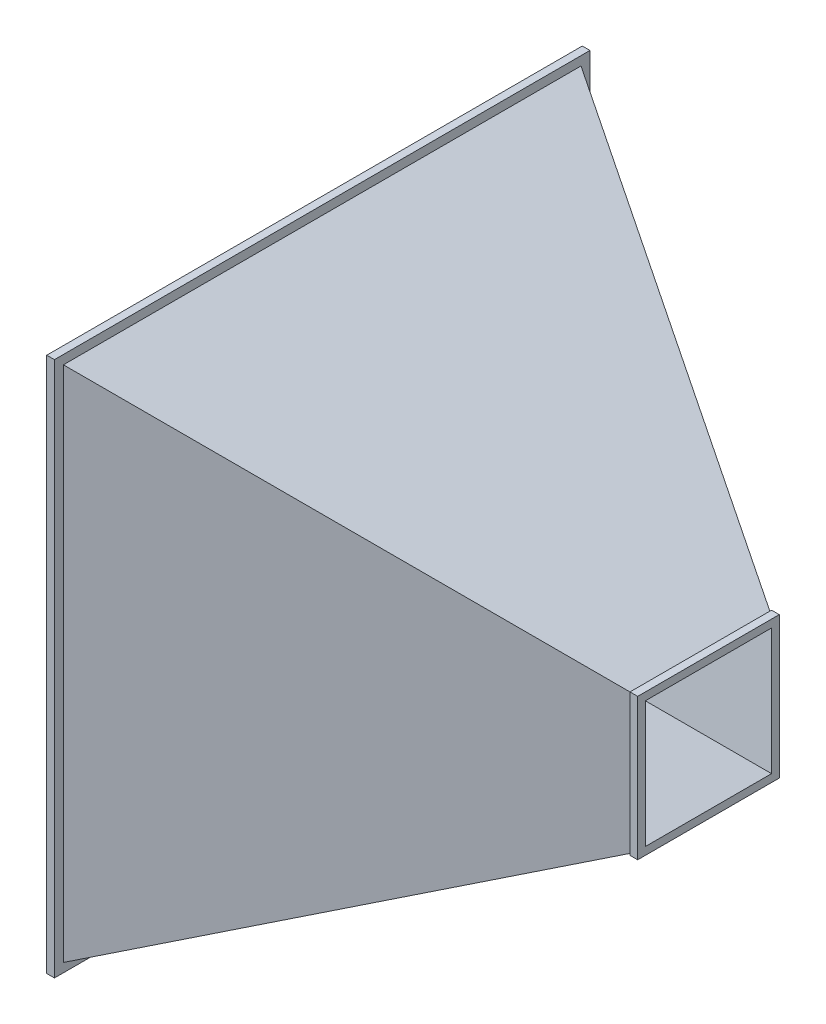
ISO-10303-21;
HEADER;
FILE_DESCRIPTION(('STEP AP214'),'2;1');
FILE_NAME('part.step','',(''),(''),'','','');
FILE_SCHEMA(('AUTOMOTIVE_DESIGN { 1 0 10303 214 1 1 1 1 }'));
ENDSEC;
DATA;
#1=APPLICATION_CONTEXT('core data for automotive mechanical design processes');
#2=APPLICATION_PROTOCOL_DEFINITION('international standard','automotive_design',2000,#1);
#3=PRODUCT_CONTEXT('',#1,'mechanical');
#4=PRODUCT('Part','Part','',(#3));
#5=PRODUCT_RELATED_PRODUCT_CATEGORY('part','',(#4));
#6=PRODUCT_DEFINITION_FORMATION('','',#4);
#7=PRODUCT_DEFINITION_CONTEXT('part definition',#1,'design');
#8=PRODUCT_DEFINITION('design','',#6,#7);
#9=PRODUCT_DEFINITION_SHAPE('','',#8);
#10=(LENGTH_UNIT() NAMED_UNIT(*) SI_UNIT(.MILLI.,.METRE.));
#11=(NAMED_UNIT(*) PLANE_ANGLE_UNIT() SI_UNIT($,.RADIAN.));
#12=(NAMED_UNIT(*) SI_UNIT($,.STERADIAN.) SOLID_ANGLE_UNIT());
#13=UNCERTAINTY_MEASURE_WITH_UNIT(LENGTH_MEASURE(1.E-05),#10,'distance_accuracy_value','');
#14=(GEOMETRIC_REPRESENTATION_CONTEXT(3) GLOBAL_UNCERTAINTY_ASSIGNED_CONTEXT((#13)) GLOBAL_UNIT_ASSIGNED_CONTEXT((#10,
#11,#12)) REPRESENTATION_CONTEXT('',''));
#15=CARTESIAN_POINT('',(0.,0.,0.));
#16=DIRECTION('',(0.,0.,1.));
#17=DIRECTION('',(1.,0.,0.));
#18=AXIS2_PLACEMENT_3D('',#15,#16,#17);
#19=CARTESIAN_POINT('',(768.,0.,0.));
#20=DIRECTION('',(1.,0.,0.));
#21=DIRECTION('',(0.,0.,-1.));
#22=AXIS2_PLACEMENT_3D('',#19,#20,#21);
#23=PLANE('',#22);
#24=DIRECTION('',(0.,0.,-1.));
#25=VECTOR('',#24,1.);
#26=CARTESIAN_POINT('',(768.,-138.,138.));
#27=LINE('',#26,#25);
#28=CARTESIAN_POINT('',(768.,-138.,138.));
#29=VERTEX_POINT('',#28);
#30=CARTESIAN_POINT('',(768.,-138.,-138.));
#31=VERTEX_POINT('',#30);
#32=EDGE_CURVE('E316',#29,#31,#27,.T.);
#33=ORIENTED_EDGE('',*,*,#32,.T.);
#34=DIRECTION('',(0.,1.,0.));
#35=VECTOR('',#34,1.);
#36=CARTESIAN_POINT('',(768.,-138.,-138.));
#37=LINE('',#36,#35);
#38=CARTESIAN_POINT('',(768.,138.,-138.));
#39=VERTEX_POINT('',#38);
#40=EDGE_CURVE('E341',#31,#39,#37,.T.);
#41=ORIENTED_EDGE('',*,*,#40,.T.);
#42=DIRECTION('',(0.,0.,1.));
#43=VECTOR('',#42,1.);
#44=CARTESIAN_POINT('',(768.,138.,-138.));
#45=LINE('',#44,#43);
#46=CARTESIAN_POINT('',(768.,138.,138.));
#47=VERTEX_POINT('',#46);
#48=EDGE_CURVE('E345',#39,#47,#45,.T.);
#49=ORIENTED_EDGE('',*,*,#48,.T.);
#50=DIRECTION('',(0.,-1.,0.));
#51=VECTOR('',#50,1.);
#52=CARTESIAN_POINT('',(768.,138.,138.));
#53=LINE('',#52,#51);
#54=EDGE_CURVE('E325',#47,#29,#53,.T.);
#55=ORIENTED_EDGE('',*,*,#54,.T.);
#56=EDGE_LOOP('',(#33,#41,#49,#55));
#57=FACE_BOUND('',#56,.T.);
#58=DIRECTION('',(0.,1.,0.));
#59=VECTOR('',#58,1.);
#60=CARTESIAN_POINT('',(768.,123.,-123.));
#61=LINE('',#60,#59);
#62=CARTESIAN_POINT('',(768.,-123.,-123.));
#63=VERTEX_POINT('',#62);
#64=CARTESIAN_POINT('',(768.,123.,-123.));
#65=VERTEX_POINT('',#64);
#66=EDGE_CURVE('E67',#63,#65,#61,.T.);
#67=ORIENTED_EDGE('',*,*,#66,.F.);
#68=DIRECTION('',(0.,0.,-1.));
#69=VECTOR('',#68,1.);
#70=CARTESIAN_POINT('',(768.,-123.,123.));
#71=LINE('',#70,#69);
#72=CARTESIAN_POINT('',(768.,-123.,123.));
#73=VERTEX_POINT('',#72);
#74=EDGE_CURVE('E204',#73,#63,#71,.T.);
#75=ORIENTED_EDGE('',*,*,#74,.F.);
#76=DIRECTION('',(0.,-1.,0.));
#77=VECTOR('',#76,1.);
#78=CARTESIAN_POINT('',(768.,123.,123.));
#79=LINE('',#78,#77);
#80=CARTESIAN_POINT('',(768.,123.,123.));
#81=VERTEX_POINT('',#80);
#82=EDGE_CURVE('E401',#81,#73,#79,.T.);
#83=ORIENTED_EDGE('',*,*,#82,.F.);
#84=DIRECTION('',(0.,0.,1.));
#85=VECTOR('',#84,1.);
#86=CARTESIAN_POINT('',(768.,123.,123.));
#87=LINE('',#86,#85);
#88=EDGE_CURVE('E386',#65,#81,#87,.T.);
#89=ORIENTED_EDGE('',*,*,#88,.F.);
#90=EDGE_LOOP('',(#67,#75,#83,#89));
#91=FACE_BOUND('',#90,.T.);
#92=ADVANCED_FACE('F63',(#57,#91),#23,.T.);
#93=CARTESIAN_POINT('',(0.,0.,0.));
#94=DIRECTION('',(-1.,0.,0.));
#95=DIRECTION('',(0.,0.,1.));
#96=AXIS2_PLACEMENT_3D('',#93,#94,#95);
#97=PLANE('',#96);
#98=DIRECTION('',(0.,0.,-1.));
#99=VECTOR('',#98,1.);
#100=CARTESIAN_POINT('',(0.,522.,522.));
#101=LINE('',#100,#99);
#102=CARTESIAN_POINT('',(0.,522.,522.));
#103=VERTEX_POINT('',#102);
#104=CARTESIAN_POINT('',(0.,522.,-522.));
#105=VERTEX_POINT('',#104);
#106=EDGE_CURVE('E436',#103,#105,#101,.T.);
#107=ORIENTED_EDGE('',*,*,#106,.T.);
#108=DIRECTION('',(0.,-1.,0.));
#109=VECTOR('',#108,1.);
#110=CARTESIAN_POINT('',(0.,522.,-522.));
#111=LINE('',#110,#109);
#112=CARTESIAN_POINT('',(0.,-522.,-522.));
#113=VERTEX_POINT('',#112);
#114=EDGE_CURVE('E720',#105,#113,#111,.T.);
#115=ORIENTED_EDGE('',*,*,#114,.T.);
#116=DIRECTION('',(0.,0.,1.));
#117=VECTOR('',#116,1.);
#118=CARTESIAN_POINT('',(0.,-522.,-522.));
#119=LINE('',#118,#117);
#120=CARTESIAN_POINT('',(0.,-522.,522.));
#121=VERTEX_POINT('',#120);
#122=EDGE_CURVE('E724',#113,#121,#119,.T.);
#123=ORIENTED_EDGE('',*,*,#122,.T.);
#124=DIRECTION('',(0.,1.,0.));
#125=VECTOR('',#124,1.);
#126=CARTESIAN_POINT('',(0.,-522.,522.));
#127=LINE('',#126,#125);
#128=EDGE_CURVE('E703',#121,#103,#127,.T.);
#129=ORIENTED_EDGE('',*,*,#128,.T.);
#130=EDGE_LOOP('',(#107,#115,#123,#129));
#131=FACE_BOUND('',#130,.T.);
#132=DIRECTION('',(0.,1.,0.));
#133=VECTOR('',#132,1.);
#134=CARTESIAN_POINT('',(0.,512.,512.));
#135=LINE('',#134,#133);
#136=CARTESIAN_POINT('',(0.,-512.,512.));
#137=VERTEX_POINT('',#136);
#138=CARTESIAN_POINT('',(0.,512.,512.));
#139=VERTEX_POINT('',#138);
#140=EDGE_CURVE('E90',#137,#139,#135,.T.);
#141=ORIENTED_EDGE('',*,*,#140,.F.);
#142=DIRECTION('',(0.,0.,1.));
#143=VECTOR('',#142,1.);
#144=CARTESIAN_POINT('',(0.,-512.,-512.));
#145=LINE('',#144,#143);
#146=CARTESIAN_POINT('',(0.,-512.,-512.));
#147=VERTEX_POINT('',#146);
#148=EDGE_CURVE('E195',#147,#137,#145,.T.);
#149=ORIENTED_EDGE('',*,*,#148,.F.);
#150=DIRECTION('',(0.,-1.,0.));
#151=VECTOR('',#150,1.);
#152=CARTESIAN_POINT('',(0.,512.,-512.));
#153=LINE('',#152,#151);
#154=CARTESIAN_POINT('',(0.,512.,-512.));
#155=VERTEX_POINT('',#154);
#156=EDGE_CURVE('E183',#155,#147,#153,.T.);
#157=ORIENTED_EDGE('',*,*,#156,.F.);
#158=DIRECTION('',(0.,0.,-1.));
#159=VECTOR('',#158,1.);
#160=CARTESIAN_POINT('',(0.,512.,-512.));
#161=LINE('',#160,#159);
#162=EDGE_CURVE('E194',#139,#155,#161,.T.);
#163=ORIENTED_EDGE('',*,*,#162,.F.);
#164=EDGE_LOOP('',(#141,#149,#157,#163));
#165=FACE_BOUND('',#164,.T.);
#166=ADVANCED_FACE('F210',(#131,#165),#97,.T.);
#167=CARTESIAN_POINT('',(204.8,-409.6,0.));
#168=DIRECTION('',(-0.447213595499958,0.894427190999916,0.));
#169=DIRECTION('',(-0.894427190999916,-0.447213595499958,0.));
#170=AXIS2_PLACEMENT_3D('',#167,#168,#169);
#171=PLANE('',#170);
#172=DIRECTION('',(0.,0.,1.));
#173=VECTOR('',#172,1.);
#174=CARTESIAN_POINT('',(15.,-504.5,0.));
#175=LINE('',#174,#173);
#176=CARTESIAN_POINT('',(14.9999999999999,-504.5,-504.5));
#177=VERTEX_POINT('',#176);
#178=CARTESIAN_POINT('',(15.,-504.5,504.5));
#179=VERTEX_POINT('',#178);
#180=EDGE_CURVE('E310',#177,#179,#175,.T.);
#181=ORIENTED_EDGE('',*,*,#180,.F.);
#182=DIRECTION('',(0.816496580927726,0.408248290463863,0.408248290463863));
#183=VECTOR('',#182,1.);
#184=CARTESIAN_POINT('',(0.,-512.,-512.));
#185=LINE('',#184,#183);
#186=CARTESIAN_POINT('',(753.,-135.5,-135.5));
#187=VERTEX_POINT('',#186);
#188=EDGE_CURVE('E264',#177,#187,#185,.T.);
#189=ORIENTED_EDGE('',*,*,#188,.T.);
#190=DIRECTION('',(0.,0.,-1.));
#191=VECTOR('',#190,1.);
#192=CARTESIAN_POINT('',(753.,-135.5,0.));
#193=LINE('',#192,#191);
#194=CARTESIAN_POINT('',(753.,-135.5,135.5));
#195=VERTEX_POINT('',#194);
#196=EDGE_CURVE('E268',#195,#187,#193,.T.);
#197=ORIENTED_EDGE('',*,*,#196,.F.);
#198=DIRECTION('',(0.816496580927726,0.408248290463863,-0.408248290463863));
#199=VECTOR('',#198,1.);
#200=CARTESIAN_POINT('',(0.,-512.,512.));
#201=LINE('',#200,#199);
#202=EDGE_CURVE('E259',#179,#195,#201,.T.);
#203=ORIENTED_EDGE('',*,*,#202,.F.);
#204=EDGE_LOOP('',(#181,#189,#197,#203));
#205=FACE_BOUND('',#204,.T.);
#206=ADVANCED_FACE('F233',(#205),#171,.F.);
#207=CARTESIAN_POINT('',(204.8,0.,409.6));
#208=DIRECTION('',(-0.447213595499958,0.,-0.894427190999916));
#209=DIRECTION('',(-0.894427190999916,0.,0.447213595499958));
#210=AXIS2_PLACEMENT_3D('',#207,#208,#209);
#211=PLANE('',#210);
#212=DIRECTION('',(0.,1.,0.));
#213=VECTOR('',#212,1.);
#214=CARTESIAN_POINT('',(15.,-1.09395999203787E-13,504.5));
#215=LINE('',#214,#213);
#216=CARTESIAN_POINT('',(15.,504.5,504.5));
#217=VERTEX_POINT('',#216);
#218=EDGE_CURVE('E305',#179,#217,#215,.T.);
#219=ORIENTED_EDGE('',*,*,#218,.F.);
#220=ORIENTED_EDGE('',*,*,#202,.T.);
#221=DIRECTION('',(0.,-1.,0.));
#222=VECTOR('',#221,1.);
#223=CARTESIAN_POINT('',(753.,0.,135.5));
#224=LINE('',#223,#222);
#225=CARTESIAN_POINT('',(753.,135.5,135.5));
#226=VERTEX_POINT('',#225);
#227=EDGE_CURVE('E292',#226,#195,#224,.T.);
#228=ORIENTED_EDGE('',*,*,#227,.F.);
#229=DIRECTION('',(0.816496580927726,-0.408248290463863,-0.408248290463863));
#230=VECTOR('',#229,1.);
#231=CARTESIAN_POINT('',(0.,512.,512.));
#232=LINE('',#231,#230);
#233=EDGE_CURVE('E279',#217,#226,#232,.T.);
#234=ORIENTED_EDGE('',*,*,#233,.F.);
#235=EDGE_LOOP('',(#219,#220,#228,#234));
#236=FACE_BOUND('',#235,.T.);
#237=ADVANCED_FACE('F369',(#236),#211,.F.);
#238=CARTESIAN_POINT('',(204.8,0.,-409.6));
#239=DIRECTION('',(-0.447213595499958,0.,0.894427190999916));
#240=DIRECTION('',(0.894427190999916,0.,0.447213595499958));
#241=AXIS2_PLACEMENT_3D('',#238,#239,#240);
#242=PLANE('',#241);
#243=DIRECTION('',(0.,-1.,0.));
#244=VECTOR('',#243,1.);
#245=CARTESIAN_POINT('',(15.,1.09395999203787E-13,-504.5));
#246=LINE('',#245,#244);
#247=CARTESIAN_POINT('',(15.,504.5,-504.5));
#248=VERTEX_POINT('',#247);
#249=EDGE_CURVE('E300',#248,#177,#246,.T.);
#250=ORIENTED_EDGE('',*,*,#249,.F.);
#251=DIRECTION('',(0.816496580927726,-0.408248290463863,0.408248290463863));
#252=VECTOR('',#251,1.);
#253=CARTESIAN_POINT('',(0.,512.,-512.));
#254=LINE('',#253,#252);
#255=CARTESIAN_POINT('',(753.,135.5,-135.5));
#256=VERTEX_POINT('',#255);
#257=EDGE_CURVE('E263',#248,#256,#254,.T.);
#258=ORIENTED_EDGE('',*,*,#257,.T.);
#259=DIRECTION('',(0.,1.,0.));
#260=VECTOR('',#259,1.);
#261=CARTESIAN_POINT('',(753.,0.,-135.5));
#262=LINE('',#261,#260);
#263=EDGE_CURVE('E294',#187,#256,#262,.T.);
#264=ORIENTED_EDGE('',*,*,#263,.F.);
#265=ORIENTED_EDGE('',*,*,#188,.F.);
#266=EDGE_LOOP('',(#250,#258,#264,#265));
#267=FACE_BOUND('',#266,.T.);
#268=ADVANCED_FACE('F301',(#267),#242,.F.);
#269=CARTESIAN_POINT('',(204.8,409.6,0.));
#270=DIRECTION('',(-0.447213595499958,-0.894427190999916,0.));
#271=DIRECTION('',(0.894427190999916,-0.447213595499958,0.));
#272=AXIS2_PLACEMENT_3D('',#269,#270,#271);
#273=PLANE('',#272);
#274=DIRECTION('',(0.,0.,-1.));
#275=VECTOR('',#274,1.);
#276=CARTESIAN_POINT('',(15.,504.5,0.));
#277=LINE('',#276,#275);
#278=EDGE_CURVE('E12',#217,#248,#277,.T.);
#279=ORIENTED_EDGE('',*,*,#278,.F.);
#280=ORIENTED_EDGE('',*,*,#233,.T.);
#281=DIRECTION('',(0.,0.,1.));
#282=VECTOR('',#281,1.);
#283=CARTESIAN_POINT('',(753.,135.5,0.));
#284=LINE('',#283,#282);
#285=EDGE_CURVE('E74',#256,#226,#284,.T.);
#286=ORIENTED_EDGE('',*,*,#285,.F.);
#287=ORIENTED_EDGE('',*,*,#257,.F.);
#288=EDGE_LOOP('',(#279,#280,#286,#287));
#289=FACE_BOUND('',#288,.T.);
#290=ADVANCED_FACE('F295',(#289),#273,.F.);
#291=CARTESIAN_POINT('',(753.,0.,0.));
#292=DIRECTION('',(1.,0.,0.));
#293=DIRECTION('',(0.,0.,-1.));
#294=AXIS2_PLACEMENT_3D('',#291,#292,#293);
#295=PLANE('',#294);
#296=DIRECTION('',(0.,0.,-1.));
#297=VECTOR('',#296,1.);
#298=CARTESIAN_POINT('',(753.,-138.,138.));
#299=LINE('',#298,#297);
#300=CARTESIAN_POINT('',(753.,-138.,138.));
#301=VERTEX_POINT('',#300);
#302=CARTESIAN_POINT('',(753.,-138.,-138.));
#303=VERTEX_POINT('',#302);
#304=EDGE_CURVE('E320',#301,#303,#299,.T.);
#305=ORIENTED_EDGE('',*,*,#304,.F.);
#306=DIRECTION('',(0.,-1.,0.));
#307=VECTOR('',#306,1.);
#308=CARTESIAN_POINT('',(753.,138.,138.));
#309=LINE('',#308,#307);
#310=CARTESIAN_POINT('',(753.,138.,138.));
#311=VERTEX_POINT('',#310);
#312=EDGE_CURVE('E333',#311,#301,#309,.T.);
#313=ORIENTED_EDGE('',*,*,#312,.F.);
#314=DIRECTION('',(0.,0.,1.));
#315=VECTOR('',#314,1.);
#316=CARTESIAN_POINT('',(753.,138.,-138.));
#317=LINE('',#316,#315);
#318=CARTESIAN_POINT('',(753.,138.,-138.));
#319=VERTEX_POINT('',#318);
#320=EDGE_CURVE('E329',#319,#311,#317,.T.);
#321=ORIENTED_EDGE('',*,*,#320,.F.);
#322=DIRECTION('',(0.,1.,0.));
#323=VECTOR('',#322,1.);
#324=CARTESIAN_POINT('',(753.,-138.,-138.));
#325=LINE('',#324,#323);
#326=EDGE_CURVE('E324',#303,#319,#325,.T.);
#327=ORIENTED_EDGE('',*,*,#326,.F.);
#328=EDGE_LOOP('',(#305,#313,#321,#327));
#329=FACE_BOUND('',#328,.T.);
#330=ORIENTED_EDGE('',*,*,#227,.T.);
#331=ORIENTED_EDGE('',*,*,#196,.T.);
#332=ORIENTED_EDGE('',*,*,#263,.T.);
#333=ORIENTED_EDGE('',*,*,#285,.T.);
#334=EDGE_LOOP('',(#330,#331,#332,#333));
#335=FACE_BOUND('',#334,.T.);
#336=ADVANCED_FACE('F290',(#329,#335),#295,.F.);
#337=CARTESIAN_POINT('',(753.,-138.,138.));
#338=DIRECTION('',(0.,-1.,0.));
#339=DIRECTION('',(0.,0.,-1.));
#340=AXIS2_PLACEMENT_3D('',#337,#338,#339);
#341=PLANE('',#340);
#342=ORIENTED_EDGE('',*,*,#32,.F.);
#343=DIRECTION('',(1.,0.,0.));
#344=VECTOR('',#343,1.);
#345=CARTESIAN_POINT('',(753.,-138.,138.));
#346=LINE('',#345,#344);
#347=EDGE_CURVE('E352',#301,#29,#346,.T.);
#348=ORIENTED_EDGE('',*,*,#347,.F.);
#349=ORIENTED_EDGE('',*,*,#304,.T.);
#350=DIRECTION('',(1.,0.,0.));
#351=VECTOR('',#350,1.);
#352=CARTESIAN_POINT('',(753.,-138.,-138.));
#353=LINE('',#352,#351);
#354=EDGE_CURVE('E337',#303,#31,#353,.T.);
#355=ORIENTED_EDGE('',*,*,#354,.T.);
#356=EDGE_LOOP('',(#342,#348,#349,#355));
#357=FACE_BOUND('',#356,.T.);
#358=ADVANCED_FACE('F235',(#357),#341,.T.);
#359=CARTESIAN_POINT('',(753.,138.,138.));
#360=DIRECTION('',(0.,0.,1.));
#361=DIRECTION('',(0.,-1.,0.));
#362=AXIS2_PLACEMENT_3D('',#359,#360,#361);
#363=PLANE('',#362);
#364=ORIENTED_EDGE('',*,*,#54,.F.);
#365=DIRECTION('',(1.,0.,0.));
#366=VECTOR('',#365,1.);
#367=CARTESIAN_POINT('',(753.,138.,138.));
#368=LINE('',#367,#366);
#369=EDGE_CURVE('E355',#311,#47,#368,.T.);
#370=ORIENTED_EDGE('',*,*,#369,.F.);
#371=ORIENTED_EDGE('',*,*,#312,.T.);
#372=ORIENTED_EDGE('',*,*,#347,.T.);
#373=EDGE_LOOP('',(#364,#370,#371,#372));
#374=FACE_BOUND('',#373,.T.);
#375=ADVANCED_FACE('F646',(#374),#363,.T.);
#376=CARTESIAN_POINT('',(753.,138.,-138.));
#377=DIRECTION('',(0.,1.,0.));
#378=DIRECTION('',(0.,0.,1.));
#379=AXIS2_PLACEMENT_3D('',#376,#377,#378);
#380=PLANE('',#379);
#381=ORIENTED_EDGE('',*,*,#48,.F.);
#382=DIRECTION('',(1.,0.,0.));
#383=VECTOR('',#382,1.);
#384=CARTESIAN_POINT('',(753.,138.,-138.));
#385=LINE('',#384,#383);
#386=EDGE_CURVE('E358',#319,#39,#385,.T.);
#387=ORIENTED_EDGE('',*,*,#386,.F.);
#388=ORIENTED_EDGE('',*,*,#320,.T.);
#389=ORIENTED_EDGE('',*,*,#369,.T.);
#390=EDGE_LOOP('',(#381,#387,#388,#389));
#391=FACE_BOUND('',#390,.T.);
#392=ADVANCED_FACE('F638',(#391),#380,.T.);
#393=CARTESIAN_POINT('',(753.,-138.,-138.));
#394=DIRECTION('',(0.,0.,-1.));
#395=DIRECTION('',(0.,1.,0.));
#396=AXIS2_PLACEMENT_3D('',#393,#394,#395);
#397=PLANE('',#396);
#398=ORIENTED_EDGE('',*,*,#40,.F.);
#399=ORIENTED_EDGE('',*,*,#354,.F.);
#400=ORIENTED_EDGE('',*,*,#326,.T.);
#401=ORIENTED_EDGE('',*,*,#386,.T.);
#402=EDGE_LOOP('',(#398,#399,#400,#401));
#403=FACE_BOUND('',#402,.T.);
#404=ADVANCED_FACE('F610',(#403),#397,.T.);
#405=CARTESIAN_POINT('',(15.,0.,0.));
#406=DIRECTION('',(-1.,0.,0.));
#407=DIRECTION('',(0.,0.,1.));
#408=AXIS2_PLACEMENT_3D('',#405,#406,#407);
#409=PLANE('',#408);
#410=DIRECTION('',(0.,0.,-1.));
#411=VECTOR('',#410,1.);
#412=CARTESIAN_POINT('',(15.,522.,522.));
#413=LINE('',#412,#411);
#414=CARTESIAN_POINT('',(15.,522.,522.));
#415=VERTEX_POINT('',#414);
#416=CARTESIAN_POINT('',(15.,522.,-522.));
#417=VERTEX_POINT('',#416);
#418=EDGE_CURVE('E445',#415,#417,#413,.T.);
#419=ORIENTED_EDGE('',*,*,#418,.F.);
#420=DIRECTION('',(0.,1.,0.));
#421=VECTOR('',#420,1.);
#422=CARTESIAN_POINT('',(15.,-522.,522.));
#423=LINE('',#422,#421);
#424=CARTESIAN_POINT('',(15.,-522.,522.));
#425=VERTEX_POINT('',#424);
#426=EDGE_CURVE('E699',#425,#415,#423,.T.);
#427=ORIENTED_EDGE('',*,*,#426,.F.);
#428=DIRECTION('',(0.,0.,1.));
#429=VECTOR('',#428,1.);
#430=CARTESIAN_POINT('',(15.,-522.,-522.));
#431=LINE('',#430,#429);
#432=CARTESIAN_POINT('',(15.,-522.,-522.));
#433=VERTEX_POINT('',#432);
#434=EDGE_CURVE('E710',#433,#425,#431,.T.);
#435=ORIENTED_EDGE('',*,*,#434,.F.);
#436=DIRECTION('',(0.,-1.,0.));
#437=VECTOR('',#436,1.);
#438=CARTESIAN_POINT('',(15.,522.,-522.));
#439=LINE('',#438,#437);
#440=EDGE_CURVE('E701',#417,#433,#439,.T.);
#441=ORIENTED_EDGE('',*,*,#440,.F.);
#442=EDGE_LOOP('',(#419,#427,#435,#441));
#443=FACE_BOUND('',#442,.T.);
#444=ORIENTED_EDGE('',*,*,#249,.T.);
#445=ORIENTED_EDGE('',*,*,#180,.T.);
#446=ORIENTED_EDGE('',*,*,#218,.T.);
#447=ORIENTED_EDGE('',*,*,#278,.T.);
#448=EDGE_LOOP('',(#444,#445,#446,#447));
#449=FACE_BOUND('',#448,.T.);
#450=ADVANCED_FACE('F309',(#443,#449),#409,.F.);
#451=CARTESIAN_POINT('',(15.,522.,522.));
#452=DIRECTION('',(0.,1.,0.));
#453=DIRECTION('',(0.,0.,1.));
#454=AXIS2_PLACEMENT_3D('',#451,#452,#453);
#455=PLANE('',#454);
#456=ORIENTED_EDGE('',*,*,#106,.F.);
#457=DIRECTION('',(-1.,0.,0.));
#458=VECTOR('',#457,1.);
#459=CARTESIAN_POINT('',(15.,522.,522.));
#460=LINE('',#459,#458);
#461=EDGE_CURVE('E306',#415,#103,#460,.T.);
#462=ORIENTED_EDGE('',*,*,#461,.F.);
#463=ORIENTED_EDGE('',*,*,#418,.T.);
#464=DIRECTION('',(-1.,0.,0.));
#465=VECTOR('',#464,1.);
#466=CARTESIAN_POINT('',(15.,522.,-522.));
#467=LINE('',#466,#465);
#468=EDGE_CURVE('E709',#417,#105,#467,.T.);
#469=ORIENTED_EDGE('',*,*,#468,.T.);
#470=EDGE_LOOP('',(#456,#462,#463,#469));
#471=FACE_BOUND('',#470,.T.);
#472=ADVANCED_FACE('F593',(#471),#455,.T.);
#473=CARTESIAN_POINT('',(15.,-522.,522.));
#474=DIRECTION('',(0.,0.,1.));
#475=DIRECTION('',(1.,0.,0.));
#476=AXIS2_PLACEMENT_3D('',#473,#474,#475);
#477=PLANE('',#476);
#478=ORIENTED_EDGE('',*,*,#128,.F.);
#479=DIRECTION('',(-1.,0.,0.));
#480=VECTOR('',#479,1.);
#481=CARTESIAN_POINT('',(15.,-522.,522.));
#482=LINE('',#481,#480);
#483=EDGE_CURVE('E706',#425,#121,#482,.T.);
#484=ORIENTED_EDGE('',*,*,#483,.F.);
#485=ORIENTED_EDGE('',*,*,#426,.T.);
#486=ORIENTED_EDGE('',*,*,#461,.T.);
#487=EDGE_LOOP('',(#478,#484,#485,#486));
#488=FACE_BOUND('',#487,.T.);
#489=ADVANCED_FACE('F584',(#488),#477,.T.);
#490=CARTESIAN_POINT('',(15.,-522.,-522.));
#491=DIRECTION('',(0.,-1.,0.));
#492=DIRECTION('',(0.,0.,-1.));
#493=AXIS2_PLACEMENT_3D('',#490,#491,#492);
#494=PLANE('',#493);
#495=ORIENTED_EDGE('',*,*,#122,.F.);
#496=DIRECTION('',(-1.,0.,0.));
#497=VECTOR('',#496,1.);
#498=CARTESIAN_POINT('',(15.,-522.,-522.));
#499=LINE('',#498,#497);
#500=EDGE_CURVE('E714',#433,#113,#499,.T.);
#501=ORIENTED_EDGE('',*,*,#500,.F.);
#502=ORIENTED_EDGE('',*,*,#434,.T.);
#503=ORIENTED_EDGE('',*,*,#483,.T.);
#504=EDGE_LOOP('',(#495,#501,#502,#503));
#505=FACE_BOUND('',#504,.T.);
#506=ADVANCED_FACE('F575',(#505),#494,.T.);
#507=CARTESIAN_POINT('',(15.,522.,-522.));
#508=DIRECTION('',(0.,0.,-1.));
#509=DIRECTION('',(-1.,0.,0.));
#510=AXIS2_PLACEMENT_3D('',#507,#508,#509);
#511=PLANE('',#510);
#512=ORIENTED_EDGE('',*,*,#114,.F.);
#513=ORIENTED_EDGE('',*,*,#468,.F.);
#514=ORIENTED_EDGE('',*,*,#440,.T.);
#515=ORIENTED_EDGE('',*,*,#500,.T.);
#516=EDGE_LOOP('',(#512,#513,#514,#515));
#517=FACE_BOUND('',#516,.T.);
#518=ADVANCED_FACE('F474',(#517),#511,.T.);
#519=CARTESIAN_POINT('',(206.384747923821,-407.463975335461,0.));
#520=DIRECTION('',(-0.451853873694725,0.892091966574675,0.));
#521=DIRECTION('',(-0.892091966574675,-0.451853873694725,0.));
#522=AXIS2_PLACEMENT_3D('',#519,#520,#521);
#523=PLANE('',#522);
#524=DIRECTION('',(0.812952891466801,0.411769107787221,0.411769107787221));
#525=VECTOR('',#524,1.);
#526=CARTESIAN_POINT('',(0.,-512.,-512.));
#527=LINE('',#526,#525);
#528=EDGE_CURVE('E187',#147,#63,#527,.T.);
#529=ORIENTED_EDGE('',*,*,#528,.F.);
#530=ORIENTED_EDGE('',*,*,#148,.T.);
#531=DIRECTION('',(0.812952891466801,0.411769107787221,-0.411769107787221));
#532=VECTOR('',#531,1.);
#533=CARTESIAN_POINT('',(0.,-512.,512.));
#534=LINE('',#533,#532);
#535=EDGE_CURVE('E207',#137,#73,#534,.T.);
#536=ORIENTED_EDGE('',*,*,#535,.T.);
#537=ORIENTED_EDGE('',*,*,#74,.T.);
#538=EDGE_LOOP('',(#529,#530,#536,#537));
#539=FACE_BOUND('',#538,.T.);
#540=ADVANCED_FACE('F200',(#539),#523,.T.);
#541=CARTESIAN_POINT('',(206.384747923821,0.,407.463975335461));
#542=DIRECTION('',(-0.451853873694725,0.,-0.892091966574675));
#543=DIRECTION('',(-0.892091966574675,0.,0.451853873694725));
#544=AXIS2_PLACEMENT_3D('',#541,#542,#543);
#545=PLANE('',#544);
#546=ORIENTED_EDGE('',*,*,#535,.F.);
#547=ORIENTED_EDGE('',*,*,#140,.T.);
#548=DIRECTION('',(0.812952891466801,-0.411769107787221,-0.411769107787221));
#549=VECTOR('',#548,1.);
#550=CARTESIAN_POINT('',(0.,512.,512.));
#551=LINE('',#550,#549);
#552=EDGE_CURVE('E388',#139,#81,#551,.T.);
#553=ORIENTED_EDGE('',*,*,#552,.T.);
#554=ORIENTED_EDGE('',*,*,#82,.T.);
#555=EDGE_LOOP('',(#546,#547,#553,#554));
#556=FACE_BOUND('',#555,.T.);
#557=ADVANCED_FACE('F450',(#556),#545,.T.);
#558=CARTESIAN_POINT('',(206.384747923821,0.,-407.463975335461));
#559=DIRECTION('',(-0.451853873694725,0.,0.892091966574675));
#560=DIRECTION('',(0.892091966574675,0.,0.451853873694725));
#561=AXIS2_PLACEMENT_3D('',#558,#559,#560);
#562=PLANE('',#561);
#563=DIRECTION('',(0.812952891466801,-0.411769107787221,0.411769107787221));
#564=VECTOR('',#563,1.);
#565=CARTESIAN_POINT('',(0.,512.,-512.));
#566=LINE('',#565,#564);
#567=EDGE_CURVE('E188',#155,#65,#566,.T.);
#568=ORIENTED_EDGE('',*,*,#567,.F.);
#569=ORIENTED_EDGE('',*,*,#156,.T.);
#570=ORIENTED_EDGE('',*,*,#528,.T.);
#571=ORIENTED_EDGE('',*,*,#66,.T.);
#572=EDGE_LOOP('',(#568,#569,#570,#571));
#573=FACE_BOUND('',#572,.T.);
#574=ADVANCED_FACE('F186',(#573),#562,.T.);
#575=CARTESIAN_POINT('',(206.384747923821,407.463975335461,0.));
#576=DIRECTION('',(-0.451853873694725,-0.892091966574675,0.));
#577=DIRECTION('',(0.892091966574675,-0.451853873694725,0.));
#578=AXIS2_PLACEMENT_3D('',#575,#576,#577);
#579=PLANE('',#578);
#580=ORIENTED_EDGE('',*,*,#552,.F.);
#581=ORIENTED_EDGE('',*,*,#162,.T.);
#582=ORIENTED_EDGE('',*,*,#567,.T.);
#583=ORIENTED_EDGE('',*,*,#88,.T.);
#584=EDGE_LOOP('',(#580,#581,#582,#583));
#585=FACE_BOUND('',#584,.T.);
#586=ADVANCED_FACE('F497',(#585),#579,.T.);
#587=CLOSED_SHELL('',(#92,#166,#206,#237,#268,#290,#336,#358,#375,#392,#404,#450,#472,#489,#506,
#518,#540,#557,#574,#586));
#588=MANIFOLD_SOLID_BREP('B2',#587);
#589=ADVANCED_BREP_SHAPE_REPRESENTATION('',(#18,#588),#14);
#590=SHAPE_DEFINITION_REPRESENTATION(#9,#589);
ENDSEC;
END-ISO-10303-21;
